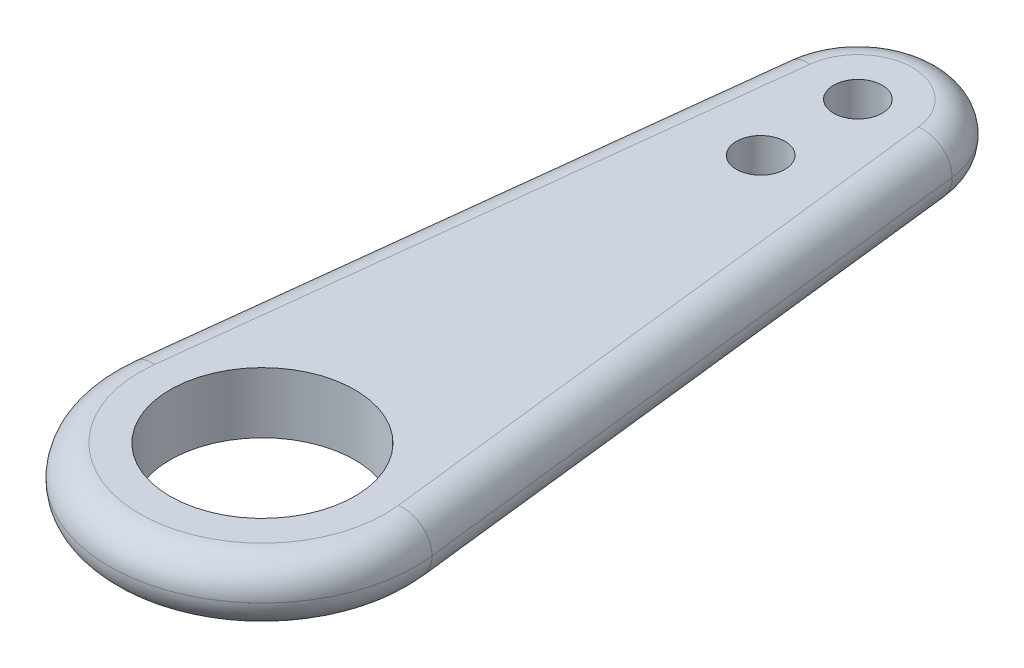
ISO-10303-21;
HEADER;
FILE_DESCRIPTION(('STEP AP214'),'2;1');
FILE_NAME('part.step','',(''),(''),'','','');
FILE_SCHEMA(('AUTOMOTIVE_DESIGN { 1 0 10303 214 1 1 1 1 }'));
ENDSEC;
DATA;
#1=APPLICATION_CONTEXT('core data for automotive mechanical design processes');
#2=APPLICATION_PROTOCOL_DEFINITION('international standard','automotive_design',2000,#1);
#3=PRODUCT_CONTEXT('',#1,'mechanical');
#4=PRODUCT('Part','Part','',(#3));
#5=PRODUCT_RELATED_PRODUCT_CATEGORY('part','',(#4));
#6=PRODUCT_DEFINITION_FORMATION('','',#4);
#7=PRODUCT_DEFINITION_CONTEXT('part definition',#1,'design');
#8=PRODUCT_DEFINITION('design','',#6,#7);
#9=PRODUCT_DEFINITION_SHAPE('','',#8);
#10=(LENGTH_UNIT() NAMED_UNIT(*) SI_UNIT(.MILLI.,.METRE.));
#11=(NAMED_UNIT(*) PLANE_ANGLE_UNIT() SI_UNIT($,.RADIAN.));
#12=(NAMED_UNIT(*) SI_UNIT($,.STERADIAN.) SOLID_ANGLE_UNIT());
#13=UNCERTAINTY_MEASURE_WITH_UNIT(LENGTH_MEASURE(1.E-05),#10,'distance_accuracy_value','');
#14=(GEOMETRIC_REPRESENTATION_CONTEXT(3) GLOBAL_UNCERTAINTY_ASSIGNED_CONTEXT((#13)) GLOBAL_UNIT_ASSIGNED_CONTEXT((#10,
#11,#12)) REPRESENTATION_CONTEXT('',''));
#15=CARTESIAN_POINT('',(0.,0.,0.));
#16=DIRECTION('',(0.,0.,1.));
#17=DIRECTION('',(1.,0.,0.));
#18=AXIS2_PLACEMENT_3D('',#15,#16,#17);
#19=CARTESIAN_POINT('',(0.,1.,-3.2));
#20=DIRECTION('',(0.,1.,0.));
#21=DIRECTION('',(0.,0.,1.));
#22=AXIS2_PLACEMENT_3D('',#19,#20,#21);
#23=PLANE('',#22);
#24=CARTESIAN_POINT('',(0.,1.,-3.2));
#25=DIRECTION('',(0.,1.,0.));
#26=DIRECTION('',(0.,0.,1.));
#27=AXIS2_PLACEMENT_3D('',#24,#25,#26);
#28=CIRCLE('',#27,1.8);
#29=CARTESIAN_POINT('',(1.78820626121626,1.,-3.40571428571429));
#30=VERTEX_POINT('',#29);
#31=CARTESIAN_POINT('',(-1.78820626121627,1.,-3.40571428571429));
#32=VERTEX_POINT('',#31);
#33=EDGE_CURVE('E49',#30,#32,#28,.T.);
#34=ORIENTED_EDGE('',*,*,#33,.T.);
#35=DIRECTION('',(-0.114285714285714,0.,0.993447922897926));
#36=VECTOR('',#35,1.);
#37=CARTESIAN_POINT('',(-4.01352960850762,1.,15.9382857142857));
#38=LINE('',#37,#36);
#39=CARTESIAN_POINT('',(-4.01352960850762,1.,15.9382857142857));
#40=VERTEX_POINT('',#39);
#41=EDGE_CURVE('E11',#32,#40,#38,.T.);
#42=ORIENTED_EDGE('',*,*,#41,.T.);
#43=CARTESIAN_POINT('',(0.,1.,16.4));
#44=DIRECTION('',(0.,1.,0.));
#45=DIRECTION('',(0.,0.,1.));
#46=AXIS2_PLACEMENT_3D('',#43,#44,#45);
#47=CIRCLE('',#46,4.04);
#48=CARTESIAN_POINT('',(4.01352960850762,1.,15.9382857142857));
#49=VERTEX_POINT('',#48);
#50=EDGE_CURVE('E99',#40,#49,#47,.T.);
#51=ORIENTED_EDGE('',*,*,#50,.T.);
#52=DIRECTION('',(-0.114285714285714,0.,-0.993447922897926));
#53=VECTOR('',#52,1.);
#54=CARTESIAN_POINT('',(1.78820626121626,1.,-3.40571428571429));
#55=LINE('',#54,#53);
#56=EDGE_CURVE('E101',#49,#30,#55,.T.);
#57=ORIENTED_EDGE('',*,*,#56,.T.);
#58=EDGE_LOOP('',(#34,#42,#51,#57));
#59=FACE_BOUND('',#58,.T.);
#60=CARTESIAN_POINT('',(0.,1.,-3.2));
#61=DIRECTION('',(0.,1.,0.));
#62=DIRECTION('',(0.,0.,1.));
#63=AXIS2_PLACEMENT_3D('',#60,#61,#62);
#64=CIRCLE('',#63,0.8);
#65=CARTESIAN_POINT('',(0.,1.,-2.4));
#66=VERTEX_POINT('',#65);
#67=EDGE_CURVE('E150',#66,#66,#64,.T.);
#68=ORIENTED_EDGE('',*,*,#67,.F.);
#69=EDGE_LOOP('',(#68));
#70=FACE_BOUND('',#69,.T.);
#71=CARTESIAN_POINT('',(0.,1.,0.));
#72=DIRECTION('',(0.,1.,0.));
#73=DIRECTION('',(0.,0.,1.));
#74=AXIS2_PLACEMENT_3D('',#71,#72,#73);
#75=CIRCLE('',#74,0.8);
#76=CARTESIAN_POINT('',(0.,1.,0.8));
#77=VERTEX_POINT('',#76);
#78=EDGE_CURVE('E146',#77,#77,#75,.T.);
#79=ORIENTED_EDGE('',*,*,#78,.F.);
#80=EDGE_LOOP('',(#79));
#81=FACE_BOUND('',#80,.T.);
#82=CARTESIAN_POINT('',(0.,1.,16.4));
#83=DIRECTION('',(0.,1.,0.));
#84=DIRECTION('',(0.,0.,1.));
#85=AXIS2_PLACEMENT_3D('',#82,#83,#84);
#86=CIRCLE('',#85,3.04);
#87=CARTESIAN_POINT('',(0.,1.,19.44));
#88=VERTEX_POINT('',#87);
#89=EDGE_CURVE('E156',#88,#88,#86,.T.);
#90=ORIENTED_EDGE('',*,*,#89,.F.);
#91=EDGE_LOOP('',(#90));
#92=FACE_BOUND('',#91,.T.);
#93=ADVANCED_FACE('F39',(#59,#70,#81,#92),#23,.T.);
#94=CARTESIAN_POINT('',(0.,-1.,-3.2));
#95=DIRECTION('',(0.,1.,0.));
#96=DIRECTION('',(0.,0.,1.));
#97=AXIS2_PLACEMENT_3D('',#94,#95,#96);
#98=PLANE('',#97);
#99=CARTESIAN_POINT('',(0.,-1.,16.4));
#100=DIRECTION('',(0.,1.,0.));
#101=DIRECTION('',(0.,0.,1.));
#102=AXIS2_PLACEMENT_3D('',#99,#100,#101);
#103=CIRCLE('',#102,4.04);
#104=CARTESIAN_POINT('',(4.01352960850762,-1.,15.9382857142857));
#105=VERTEX_POINT('',#104);
#106=CARTESIAN_POINT('',(-4.01352960850762,-1.,15.9382857142857));
#107=VERTEX_POINT('',#106);
#108=EDGE_CURVE('E144',#105,#107,#103,.F.);
#109=ORIENTED_EDGE('',*,*,#108,.T.);
#110=DIRECTION('',(-0.114285714285714,0.,0.993447922897926));
#111=VECTOR('',#110,1.);
#112=CARTESIAN_POINT('',(-1.78820626121627,-1.,-3.40571428571429));
#113=LINE('',#112,#111);
#114=CARTESIAN_POINT('',(-1.78820626121627,-1.,-3.40571428571429));
#115=VERTEX_POINT('',#114);
#116=EDGE_CURVE('E104',#107,#115,#113,.F.);
#117=ORIENTED_EDGE('',*,*,#116,.T.);
#118=CARTESIAN_POINT('',(0.,-1.,-3.2));
#119=DIRECTION('',(0.,1.,0.));
#120=DIRECTION('',(0.,0.,1.));
#121=AXIS2_PLACEMENT_3D('',#118,#119,#120);
#122=CIRCLE('',#121,1.8);
#123=CARTESIAN_POINT('',(1.78820626121627,-1.,-3.40571428571429));
#124=VERTEX_POINT('',#123);
#125=EDGE_CURVE('E141',#115,#124,#122,.F.);
#126=ORIENTED_EDGE('',*,*,#125,.T.);
#127=DIRECTION('',(-0.114285714285714,0.,-0.993447922897926));
#128=VECTOR('',#127,1.);
#129=CARTESIAN_POINT('',(1.78820626121626,-1.,-3.40571428571429));
#130=LINE('',#129,#128);
#131=EDGE_CURVE('E86',#124,#105,#130,.F.);
#132=ORIENTED_EDGE('',*,*,#131,.T.);
#133=EDGE_LOOP('',(#109,#117,#126,#132));
#134=FACE_BOUND('',#133,.T.);
#135=CARTESIAN_POINT('',(0.,-1.,0.));
#136=DIRECTION('',(0.,1.,0.));
#137=DIRECTION('',(0.,0.,1.));
#138=AXIS2_PLACEMENT_3D('',#135,#136,#137);
#139=CIRCLE('',#138,0.8);
#140=CARTESIAN_POINT('',(0.,-1.,0.8));
#141=VERTEX_POINT('',#140);
#142=EDGE_CURVE('E147',#141,#141,#139,.T.);
#143=ORIENTED_EDGE('',*,*,#142,.T.);
#144=EDGE_LOOP('',(#143));
#145=FACE_BOUND('',#144,.T.);
#146=CARTESIAN_POINT('',(0.,-1.,-3.2));
#147=DIRECTION('',(0.,1.,0.));
#148=DIRECTION('',(0.,0.,1.));
#149=AXIS2_PLACEMENT_3D('',#146,#147,#148);
#150=CIRCLE('',#149,0.8);
#151=CARTESIAN_POINT('',(0.,-1.,-2.4));
#152=VERTEX_POINT('',#151);
#153=EDGE_CURVE('E153',#152,#152,#150,.T.);
#154=ORIENTED_EDGE('',*,*,#153,.T.);
#155=EDGE_LOOP('',(#154));
#156=FACE_BOUND('',#155,.T.);
#157=CARTESIAN_POINT('',(0.,-1.,16.4));
#158=DIRECTION('',(0.,1.,0.));
#159=DIRECTION('',(0.,0.,1.));
#160=AXIS2_PLACEMENT_3D('',#157,#158,#159);
#161=CIRCLE('',#160,3.04);
#162=CARTESIAN_POINT('',(0.,-1.,19.44));
#163=VERTEX_POINT('',#162);
#164=EDGE_CURVE('E113',#163,#163,#161,.T.);
#165=ORIENTED_EDGE('',*,*,#164,.T.);
#166=EDGE_LOOP('',(#165));
#167=FACE_BOUND('',#166,.T.);
#168=ADVANCED_FACE('F168',(#134,#145,#156,#167),#98,.F.);
#169=CARTESIAN_POINT('',(0.,1.,0.));
#170=DIRECTION('',(0.,-1.,0.));
#171=DIRECTION('',(0.,0.,-1.));
#172=AXIS2_PLACEMENT_3D('',#169,#170,#171);
#173=CYLINDRICAL_SURFACE('',#172,0.8);
#174=ORIENTED_EDGE('',*,*,#78,.T.);
#175=EDGE_LOOP('',(#174));
#176=FACE_BOUND('',#175,.T.);
#177=ORIENTED_EDGE('',*,*,#142,.F.);
#178=EDGE_LOOP('',(#177));
#179=FACE_BOUND('',#178,.T.);
#180=ADVANCED_FACE('F174',(#176,#179),#173,.F.);
#181=CARTESIAN_POINT('',(0.,1.,-3.2));
#182=DIRECTION('',(0.,-1.,0.));
#183=DIRECTION('',(0.,0.,-1.));
#184=AXIS2_PLACEMENT_3D('',#181,#182,#183);
#185=CYLINDRICAL_SURFACE('',#184,0.8);
#186=ORIENTED_EDGE('',*,*,#67,.T.);
#187=EDGE_LOOP('',(#186));
#188=FACE_BOUND('',#187,.T.);
#189=ORIENTED_EDGE('',*,*,#153,.F.);
#190=EDGE_LOOP('',(#189));
#191=FACE_BOUND('',#190,.T.);
#192=ADVANCED_FACE('F218',(#188,#191),#185,.F.);
#193=CARTESIAN_POINT('',(0.,1.,16.4));
#194=DIRECTION('',(0.,-1.,0.));
#195=DIRECTION('',(0.,0.,-1.));
#196=AXIS2_PLACEMENT_3D('',#193,#194,#195);
#197=CYLINDRICAL_SURFACE('',#196,3.04);
#198=ORIENTED_EDGE('',*,*,#89,.T.);
#199=EDGE_LOOP('',(#198));
#200=FACE_BOUND('',#199,.T.);
#201=ORIENTED_EDGE('',*,*,#164,.F.);
#202=EDGE_LOOP('',(#201));
#203=FACE_BOUND('',#202,.T.);
#204=ADVANCED_FACE('F164',(#200,#203),#197,.F.);
#205=CARTESIAN_POINT('',(1.78820626121626,0.,-3.40571428571429));
#206=DIRECTION('',(0.114285714285714,0.,0.993447922897926));
#207=DIRECTION('',(0.993447922897926,0.,-0.114285714285714));
#208=AXIS2_PLACEMENT_3D('',#205,#206,#207);
#209=CYLINDRICAL_SURFACE('',#208,1.);
#210=CARTESIAN_POINT('',(1.78820626121626,0.,-3.40571428571429));
#211=DIRECTION('',(-0.114285714285714,0.,-0.993447922897926));
#212=DIRECTION('',(-0.993447922897926,0.,0.114285714285714));
#213=AXIS2_PLACEMENT_3D('',#210,#211,#212);
#214=CIRCLE('',#213,1.);
#215=CARTESIAN_POINT('',(2.78165418411419,0.,-3.52));
#216=VERTEX_POINT('',#215);
#217=EDGE_CURVE('E43',#30,#216,#214,.T.);
#218=ORIENTED_EDGE('',*,*,#217,.F.);
#219=ORIENTED_EDGE('',*,*,#56,.F.);
#220=CARTESIAN_POINT('',(4.01352960850762,0.,15.9382857142857));
#221=DIRECTION('',(0.114285714285716,0.,0.993447922897926));
#222=DIRECTION('',(0.993447922897926,0.,-0.114285714285716));
#223=AXIS2_PLACEMENT_3D('',#220,#221,#222);
#224=CIRCLE('',#223,1.);
#225=CARTESIAN_POINT('',(5.00697753140555,0.,15.824));
#226=VERTEX_POINT('',#225);
#227=EDGE_CURVE('E73',#226,#49,#224,.T.);
#228=ORIENTED_EDGE('',*,*,#227,.F.);
#229=DIRECTION('',(-0.114285714285714,0.,-0.993447922897926));
#230=VECTOR('',#229,1.);
#231=CARTESIAN_POINT('',(5.00697753140555,0.,15.824));
#232=LINE('',#231,#230);
#233=EDGE_CURVE('E112',#216,#226,#232,.F.);
#234=ORIENTED_EDGE('',*,*,#233,.F.);
#235=EDGE_LOOP('',(#218,#219,#228,#234));
#236=FACE_BOUND('',#235,.T.);
#237=ADVANCED_FACE('F41',(#236),#209,.T.);
#238=CARTESIAN_POINT('',(0.,0.,-3.2));
#239=DIRECTION('',(0.,1.,0.));
#240=DIRECTION('',(0.,0.,1.));
#241=AXIS2_PLACEMENT_3D('',#238,#239,#240);
#242=TOROIDAL_SURFACE('',#241,1.8,1.);
#243=ORIENTED_EDGE('',*,*,#33,.F.);
#244=ORIENTED_EDGE('',*,*,#217,.T.);
#245=CARTESIAN_POINT('',(0.,0.,-3.2));
#246=DIRECTION('',(0.,1.,0.));
#247=DIRECTION('',(0.,0.,1.));
#248=AXIS2_PLACEMENT_3D('',#245,#246,#247);
#249=CIRCLE('',#248,2.8);
#250=CARTESIAN_POINT('',(-2.7816541841142,0.,-3.52));
#251=VERTEX_POINT('',#250);
#252=EDGE_CURVE('E119',#251,#216,#249,.F.);
#253=ORIENTED_EDGE('',*,*,#252,.F.);
#254=CARTESIAN_POINT('',(-1.78820626121627,0.,-3.40571428571429));
#255=DIRECTION('',(-0.114285714285714,0.,0.993447922897926));
#256=DIRECTION('',(0.993447922897926,0.,0.114285714285714));
#257=AXIS2_PLACEMENT_3D('',#254,#255,#256);
#258=CIRCLE('',#257,1.);
#259=EDGE_CURVE('E122',#32,#251,#258,.T.);
#260=ORIENTED_EDGE('',*,*,#259,.F.);
#261=EDGE_LOOP('',(#243,#244,#253,#260));
#262=FACE_BOUND('',#261,.T.);
#263=ADVANCED_FACE('F200',(#262),#242,.T.);
#264=CARTESIAN_POINT('',(0.,0.,16.4));
#265=DIRECTION('',(0.,1.,0.));
#266=DIRECTION('',(0.,0.,1.));
#267=AXIS2_PLACEMENT_3D('',#264,#265,#266);
#268=TOROIDAL_SURFACE('',#267,4.04,1.);
#269=ORIENTED_EDGE('',*,*,#227,.T.);
#270=ORIENTED_EDGE('',*,*,#50,.F.);
#271=CARTESIAN_POINT('',(-4.01352960850762,0.,15.9382857142857));
#272=DIRECTION('',(0.114285714285713,0.,-0.993447922897926));
#273=DIRECTION('',(-0.993447922897927,0.,-0.114285714285713));
#274=AXIS2_PLACEMENT_3D('',#271,#272,#273);
#275=CIRCLE('',#274,1.);
#276=CARTESIAN_POINT('',(-5.00697753140555,0.,15.824));
#277=VERTEX_POINT('',#276);
#278=EDGE_CURVE('E125',#277,#40,#275,.T.);
#279=ORIENTED_EDGE('',*,*,#278,.F.);
#280=CARTESIAN_POINT('',(0.,0.,16.4));
#281=DIRECTION('',(0.,1.,0.));
#282=DIRECTION('',(0.,0.,1.));
#283=AXIS2_PLACEMENT_3D('',#280,#281,#282);
#284=CIRCLE('',#283,5.04);
#285=EDGE_CURVE('E110',#226,#277,#284,.F.);
#286=ORIENTED_EDGE('',*,*,#285,.F.);
#287=EDGE_LOOP('',(#269,#270,#279,#286));
#288=FACE_BOUND('',#287,.T.);
#289=ADVANCED_FACE('F108',(#288),#268,.T.);
#290=CARTESIAN_POINT('',(1.78820626121626,0.,-3.40571428571429));
#291=DIRECTION('',(-0.114285714285714,0.,-0.993447922897926));
#292=DIRECTION('',(-0.993447922897926,0.,0.114285714285714));
#293=AXIS2_PLACEMENT_3D('',#290,#291,#292);
#294=CYLINDRICAL_SURFACE('',#293,1.);
#295=CARTESIAN_POINT('',(4.01352960850762,0.,15.9382857142857));
#296=DIRECTION('',(0.114285714285716,0.,0.993447922897926));
#297=DIRECTION('',(0.993447922897926,0.,-0.114285714285716));
#298=AXIS2_PLACEMENT_3D('',#295,#296,#297);
#299=CIRCLE('',#298,1.);
#300=EDGE_CURVE('E128',#105,#226,#299,.T.);
#301=ORIENTED_EDGE('',*,*,#300,.F.);
#302=ORIENTED_EDGE('',*,*,#131,.F.);
#303=CARTESIAN_POINT('',(1.78820626121626,0.,-3.40571428571429));
#304=DIRECTION('',(-0.114285714285714,0.,-0.993447922897926));
#305=DIRECTION('',(-0.993447922897926,0.,0.114285714285714));
#306=AXIS2_PLACEMENT_3D('',#303,#304,#305);
#307=CIRCLE('',#306,1.);
#308=EDGE_CURVE('E114',#216,#124,#307,.T.);
#309=ORIENTED_EDGE('',*,*,#308,.F.);
#310=ORIENTED_EDGE('',*,*,#233,.T.);
#311=EDGE_LOOP('',(#301,#302,#309,#310));
#312=FACE_BOUND('',#311,.T.);
#313=ADVANCED_FACE('F194',(#312),#294,.T.);
#314=CARTESIAN_POINT('',(0.,0.,-3.2));
#315=DIRECTION('',(0.,1.,0.));
#316=DIRECTION('',(0.,0.,1.));
#317=AXIS2_PLACEMENT_3D('',#314,#315,#316);
#318=TOROIDAL_SURFACE('',#317,1.8,1.);
#319=ORIENTED_EDGE('',*,*,#308,.T.);
#320=ORIENTED_EDGE('',*,*,#125,.F.);
#321=CARTESIAN_POINT('',(-1.78820626121627,0.,-3.40571428571429));
#322=DIRECTION('',(-0.114285714285714,0.,0.993447922897926));
#323=DIRECTION('',(0.993447922897926,0.,0.114285714285714));
#324=AXIS2_PLACEMENT_3D('',#321,#322,#323);
#325=CIRCLE('',#324,1.);
#326=EDGE_CURVE('E130',#251,#115,#325,.T.);
#327=ORIENTED_EDGE('',*,*,#326,.F.);
#328=ORIENTED_EDGE('',*,*,#252,.T.);
#329=EDGE_LOOP('',(#319,#320,#327,#328));
#330=FACE_BOUND('',#329,.T.);
#331=ADVANCED_FACE('F190',(#330),#318,.T.);
#332=CARTESIAN_POINT('',(-1.78820626121627,0.,-3.40571428571429));
#333=DIRECTION('',(0.114285714285714,0.,-0.993447922897926));
#334=DIRECTION('',(-0.993447922897926,0.,-0.114285714285714));
#335=AXIS2_PLACEMENT_3D('',#332,#333,#334);
#336=CYLINDRICAL_SURFACE('',#335,1.);
#337=ORIENTED_EDGE('',*,*,#41,.F.);
#338=ORIENTED_EDGE('',*,*,#259,.T.);
#339=DIRECTION('',(-0.114285714285714,0.,0.993447922897926));
#340=VECTOR('',#339,1.);
#341=CARTESIAN_POINT('',(-2.7816541841142,0.,-3.52));
#342=LINE('',#341,#340);
#343=EDGE_CURVE('E132',#277,#251,#342,.F.);
#344=ORIENTED_EDGE('',*,*,#343,.F.);
#345=ORIENTED_EDGE('',*,*,#278,.T.);
#346=EDGE_LOOP('',(#337,#338,#344,#345));
#347=FACE_BOUND('',#346,.T.);
#348=ADVANCED_FACE('F186',(#347),#336,.T.);
#349=CARTESIAN_POINT('',(0.,0.,16.4));
#350=DIRECTION('',(0.,1.,0.));
#351=DIRECTION('',(0.,0.,1.));
#352=AXIS2_PLACEMENT_3D('',#349,#350,#351);
#353=TOROIDAL_SURFACE('',#352,4.04,1.);
#354=ORIENTED_EDGE('',*,*,#300,.T.);
#355=ORIENTED_EDGE('',*,*,#285,.T.);
#356=CARTESIAN_POINT('',(-4.01352960850762,0.,15.9382857142857));
#357=DIRECTION('',(0.114285714285713,0.,-0.993447922897926));
#358=DIRECTION('',(-0.993447922897927,0.,-0.114285714285713));
#359=AXIS2_PLACEMENT_3D('',#356,#357,#358);
#360=CIRCLE('',#359,1.);
#361=EDGE_CURVE('E135',#107,#277,#360,.T.);
#362=ORIENTED_EDGE('',*,*,#361,.F.);
#363=ORIENTED_EDGE('',*,*,#108,.F.);
#364=EDGE_LOOP('',(#354,#355,#362,#363));
#365=FACE_BOUND('',#364,.T.);
#366=ADVANCED_FACE('F182',(#365),#353,.T.);
#367=CARTESIAN_POINT('',(-1.78820626121627,0.,-3.40571428571429));
#368=DIRECTION('',(-0.114285714285714,0.,0.993447922897926));
#369=DIRECTION('',(0.993447922897926,0.,0.114285714285714));
#370=AXIS2_PLACEMENT_3D('',#367,#368,#369);
#371=CYLINDRICAL_SURFACE('',#370,1.);
#372=ORIENTED_EDGE('',*,*,#326,.T.);
#373=ORIENTED_EDGE('',*,*,#116,.F.);
#374=ORIENTED_EDGE('',*,*,#361,.T.);
#375=ORIENTED_EDGE('',*,*,#343,.T.);
#376=EDGE_LOOP('',(#372,#373,#374,#375));
#377=FACE_BOUND('',#376,.T.);
#378=ADVANCED_FACE('F179',(#377),#371,.T.);
#379=CLOSED_SHELL('',(#93,#168,#180,#192,#204,#237,#263,#289,#313,#331,#348,#366,#378));
#380=MANIFOLD_SOLID_BREP('B2',#379);
#381=ADVANCED_BREP_SHAPE_REPRESENTATION('',(#18,#380),#14);
#382=SHAPE_DEFINITION_REPRESENTATION(#9,#381);
ENDSEC;
END-ISO-10303-21;
